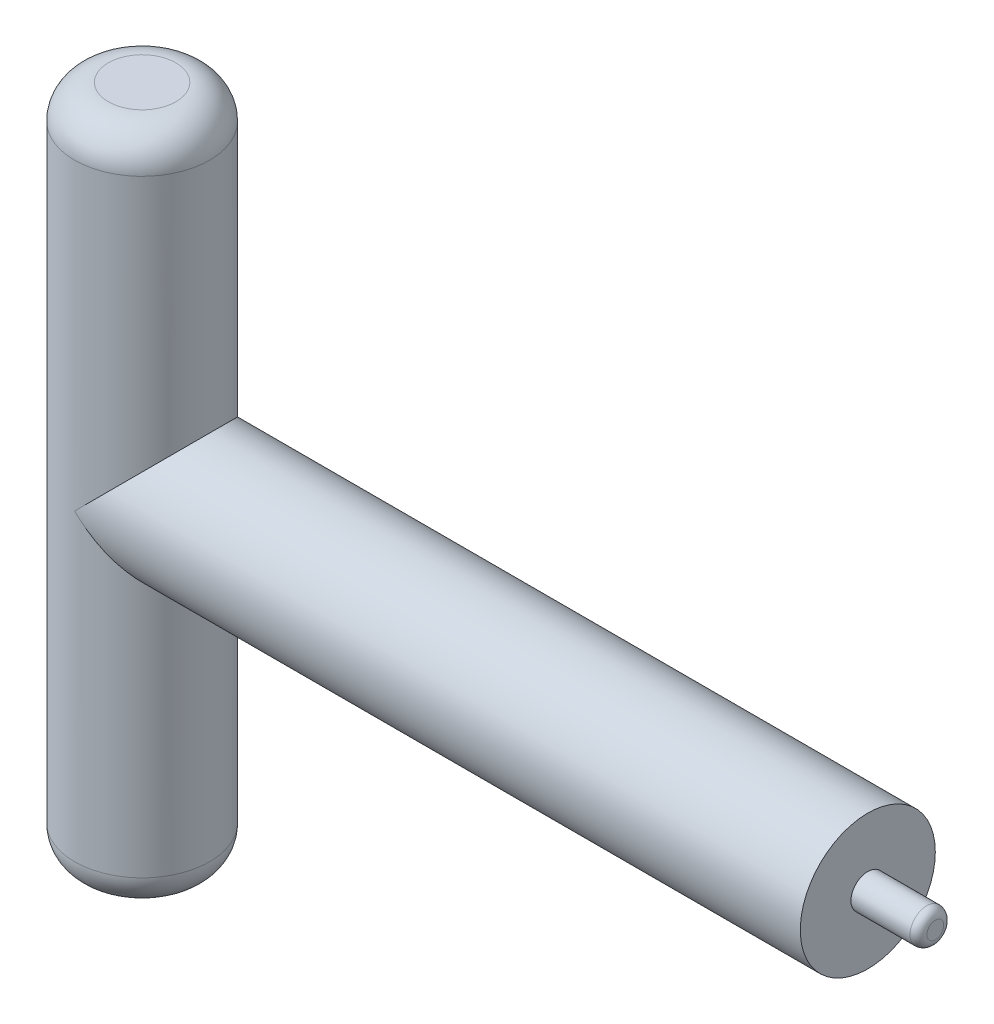
ISO-10303-21;
HEADER;
FILE_DESCRIPTION(('STEP AP214'),'2;1');
FILE_NAME('part.step','',(''),(''),'','','');
FILE_SCHEMA(('AUTOMOTIVE_DESIGN { 1 0 10303 214 1 1 1 1 }'));
ENDSEC;
DATA;
#1=APPLICATION_CONTEXT('core data for automotive mechanical design processes');
#2=APPLICATION_PROTOCOL_DEFINITION('international standard','automotive_design',2000,#1);
#3=PRODUCT_CONTEXT('',#1,'mechanical');
#4=PRODUCT('Part','Part','',(#3));
#5=PRODUCT_RELATED_PRODUCT_CATEGORY('part','',(#4));
#6=PRODUCT_DEFINITION_FORMATION('','',#4);
#7=PRODUCT_DEFINITION_CONTEXT('part definition',#1,'design');
#8=PRODUCT_DEFINITION('design','',#6,#7);
#9=PRODUCT_DEFINITION_SHAPE('','',#8);
#10=(LENGTH_UNIT() NAMED_UNIT(*) SI_UNIT(.MILLI.,.METRE.));
#11=(NAMED_UNIT(*) PLANE_ANGLE_UNIT() SI_UNIT($,.RADIAN.));
#12=(NAMED_UNIT(*) SI_UNIT($,.STERADIAN.) SOLID_ANGLE_UNIT());
#13=UNCERTAINTY_MEASURE_WITH_UNIT(LENGTH_MEASURE(1.E-05),#10,'distance_accuracy_value','');
#14=(GEOMETRIC_REPRESENTATION_CONTEXT(3) GLOBAL_UNCERTAINTY_ASSIGNED_CONTEXT((#13)) GLOBAL_UNIT_ASSIGNED_CONTEXT((#10,
#11,#12)) REPRESENTATION_CONTEXT('',''));
#15=CARTESIAN_POINT('',(0.,0.,0.));
#16=DIRECTION('',(0.,0.,1.));
#17=DIRECTION('',(1.,0.,0.));
#18=AXIS2_PLACEMENT_3D('',#15,#16,#17);
#19=CARTESIAN_POINT('',(136.525,0.,0.));
#20=DIRECTION('',(-1.,0.,0.));
#21=DIRECTION('',(0.,0.,1.));
#22=AXIS2_PLACEMENT_3D('',#19,#20,#21);
#23=CYLINDRICAL_SURFACE('',#22,12.7);
#24=CARTESIAN_POINT('',(136.525,0.,0.));
#25=DIRECTION('',(1.,0.,0.));
#26=DIRECTION('',(0.,0.,-1.));
#27=AXIS2_PLACEMENT_3D('',#24,#25,#26);
#28=CIRCLE('',#27,12.7);
#29=CARTESIAN_POINT('',(136.525,0.,-12.7));
#30=VERTEX_POINT('',#29);
#31=EDGE_CURVE('E59',#30,#30,#28,.T.);
#32=ORIENTED_EDGE('',*,*,#31,.F.);
#33=EDGE_LOOP('',(#32));
#34=FACE_BOUND('',#33,.T.);
#35=CARTESIAN_POINT('',(0.,0.,0.));
#36=DIRECTION('',(-0.707106781186547,-0.707106781186547,0.));
#37=DIRECTION('',(-0.707106781186547,0.707106781186547,0.));
#38=AXIS2_PLACEMENT_3D('',#35,#36,#37);
#39=ELLIPSE('',#38,17.9605122421383,12.7);
#40=CARTESIAN_POINT('',(0.,0.,12.7));
#41=VERTEX_POINT('',#40);
#42=CARTESIAN_POINT('',(0.,0.,-12.7));
#43=VERTEX_POINT('',#42);
#44=EDGE_CURVE('E55',#41,#43,#39,.F.);
#45=ORIENTED_EDGE('',*,*,#44,.T.);
#46=CARTESIAN_POINT('',(0.,0.,0.));
#47=DIRECTION('',(-0.707106781186547,0.707106781186547,0.));
#48=DIRECTION('',(-0.707106781186547,-0.707106781186547,0.));
#49=AXIS2_PLACEMENT_3D('',#46,#47,#48);
#50=ELLIPSE('',#49,17.9605122421383,12.7);
#51=EDGE_CURVE('E53',#43,#41,#50,.F.);
#52=ORIENTED_EDGE('',*,*,#51,.T.);
#53=EDGE_LOOP('',(#45,#52));
#54=FACE_BOUND('',#53,.T.);
#55=ADVANCED_FACE('F39',(#34,#54),#23,.T.);
#56=CARTESIAN_POINT('',(136.525,0.,0.));
#57=DIRECTION('',(1.,0.,0.));
#58=DIRECTION('',(0.,0.,-1.));
#59=AXIS2_PLACEMENT_3D('',#56,#57,#58);
#60=PLANE('',#59);
#61=CARTESIAN_POINT('',(136.525,0.,0.));
#62=DIRECTION('',(1.,0.,0.));
#63=DIRECTION('',(0.,0.,-1.));
#64=AXIS2_PLACEMENT_3D('',#61,#62,#63);
#65=CIRCLE('',#64,3.175);
#66=CARTESIAN_POINT('',(136.525,0.,-3.175));
#67=VERTEX_POINT('',#66);
#68=EDGE_CURVE('E62',#67,#67,#65,.T.);
#69=ORIENTED_EDGE('',*,*,#68,.F.);
#70=EDGE_LOOP('',(#69));
#71=FACE_BOUND('',#70,.T.);
#72=ORIENTED_EDGE('',*,*,#31,.T.);
#73=EDGE_LOOP('',(#72));
#74=FACE_BOUND('',#73,.T.);
#75=ADVANCED_FACE('F98',(#71,#74),#60,.T.);
#76=CARTESIAN_POINT('',(149.225,0.,0.));
#77=DIRECTION('',(-1.,0.,0.));
#78=DIRECTION('',(0.,0.,1.));
#79=AXIS2_PLACEMENT_3D('',#76,#77,#78);
#80=CYLINDRICAL_SURFACE('',#79,3.175);
#81=CARTESIAN_POINT('',(147.6375,0.,0.));
#82=DIRECTION('',(1.,0.,0.));
#83=DIRECTION('',(0.,0.,-1.));
#84=AXIS2_PLACEMENT_3D('',#81,#82,#83);
#85=CIRCLE('',#84,3.175);
#86=CARTESIAN_POINT('',(147.6375,0.,-3.175));
#87=VERTEX_POINT('',#86);
#88=EDGE_CURVE('E70',#87,#87,#85,.F.);
#89=ORIENTED_EDGE('',*,*,#88,.T.);
#90=EDGE_LOOP('',(#89));
#91=FACE_BOUND('',#90,.T.);
#92=ORIENTED_EDGE('',*,*,#68,.T.);
#93=EDGE_LOOP('',(#92));
#94=FACE_BOUND('',#93,.T.);
#95=ADVANCED_FACE('F106',(#91,#94),#80,.T.);
#96=CARTESIAN_POINT('',(149.225,0.,0.));
#97=DIRECTION('',(1.,0.,0.));
#98=DIRECTION('',(0.,0.,-1.));
#99=AXIS2_PLACEMENT_3D('',#96,#97,#98);
#100=PLANE('',#99);
#101=CARTESIAN_POINT('',(149.225,0.,0.));
#102=DIRECTION('',(1.,0.,0.));
#103=DIRECTION('',(0.,0.,-1.));
#104=AXIS2_PLACEMENT_3D('',#101,#102,#103);
#105=CIRCLE('',#104,1.5875);
#106=CARTESIAN_POINT('',(149.225,0.,-1.5875));
#107=VERTEX_POINT('',#106);
#108=EDGE_CURVE('E66',#107,#107,#105,.T.);
#109=ORIENTED_EDGE('',*,*,#108,.T.);
#110=EDGE_LOOP('',(#109));
#111=FACE_BOUND('',#110,.T.);
#112=ADVANCED_FACE('F113',(#111),#100,.T.);
#113=CARTESIAN_POINT('',(147.6375,0.,0.));
#114=DIRECTION('',(1.,0.,0.));
#115=DIRECTION('',(0.,0.,-1.));
#116=AXIS2_PLACEMENT_3D('',#113,#114,#115);
#117=DEGENERATE_TOROIDAL_SURFACE('',#116,1.5875,1.5875,.T.);
#118=ORIENTED_EDGE('',*,*,#88,.F.);
#119=EDGE_LOOP('',(#118));
#120=FACE_BOUND('',#119,.T.);
#121=ORIENTED_EDGE('',*,*,#108,.F.);
#122=EDGE_LOOP('',(#121));
#123=FACE_BOUND('',#122,.T.);
#124=ADVANCED_FACE('F112',(#120,#123),#117,.T.);
#125=CARTESIAN_POINT('',(0.,-63.5,0.));
#126=DIRECTION('',(0.,1.,0.));
#127=DIRECTION('',(0.,0.,1.));
#128=AXIS2_PLACEMENT_3D('',#125,#126,#127);
#129=CYLINDRICAL_SURFACE('',#128,12.7);
#130=CARTESIAN_POINT('',(0.,57.15,0.));
#131=DIRECTION('',(0.,1.,0.));
#132=DIRECTION('',(0.,0.,1.));
#133=AXIS2_PLACEMENT_3D('',#130,#131,#132);
#134=CIRCLE('',#133,12.7);
#135=CARTESIAN_POINT('',(0.,57.15,12.7));
#136=VERTEX_POINT('',#135);
#137=EDGE_CURVE('E47',#136,#136,#134,.F.);
#138=ORIENTED_EDGE('',*,*,#137,.T.);
#139=EDGE_LOOP('',(#138));
#140=FACE_BOUND('',#139,.T.);
#141=CARTESIAN_POINT('',(0.,-57.15,0.));
#142=DIRECTION('',(0.,1.,0.));
#143=DIRECTION('',(0.,0.,1.));
#144=AXIS2_PLACEMENT_3D('',#141,#142,#143);
#145=CIRCLE('',#144,12.7);
#146=CARTESIAN_POINT('',(0.,-57.15,12.7));
#147=VERTEX_POINT('',#146);
#148=EDGE_CURVE('E76',#147,#147,#145,.T.);
#149=ORIENTED_EDGE('',*,*,#148,.T.);
#150=EDGE_LOOP('',(#149));
#151=FACE_BOUND('',#150,.T.);
#152=ORIENTED_EDGE('',*,*,#51,.F.);
#153=ORIENTED_EDGE('',*,*,#44,.F.);
#154=EDGE_LOOP('',(#152,#153));
#155=FACE_BOUND('',#154,.T.);
#156=ADVANCED_FACE('F56',(#140,#151,#155),#129,.T.);
#157=CARTESIAN_POINT('',(0.,-63.5,0.));
#158=DIRECTION('',(0.,1.,0.));
#159=DIRECTION('',(0.,0.,1.));
#160=AXIS2_PLACEMENT_3D('',#157,#158,#159);
#161=PLANE('',#160);
#162=CARTESIAN_POINT('',(0.,-63.5,0.));
#163=DIRECTION('',(0.,1.,0.));
#164=DIRECTION('',(0.,0.,1.));
#165=AXIS2_PLACEMENT_3D('',#162,#163,#164);
#166=CIRCLE('',#165,6.35);
#167=CARTESIAN_POINT('',(0.,-63.5,6.35));
#168=VERTEX_POINT('',#167);
#169=EDGE_CURVE('E11',#168,#168,#166,.F.);
#170=ORIENTED_EDGE('',*,*,#169,.T.);
#171=EDGE_LOOP('',(#170));
#172=FACE_BOUND('',#171,.T.);
#173=ADVANCED_FACE('F90',(#172),#161,.F.);
#174=CARTESIAN_POINT('',(0.,63.5,0.));
#175=DIRECTION('',(0.,1.,0.));
#176=DIRECTION('',(0.,0.,1.));
#177=AXIS2_PLACEMENT_3D('',#174,#175,#176);
#178=PLANE('',#177);
#179=CARTESIAN_POINT('',(0.,63.5,0.));
#180=DIRECTION('',(0.,1.,0.));
#181=DIRECTION('',(0.,0.,1.));
#182=AXIS2_PLACEMENT_3D('',#179,#180,#181);
#183=CIRCLE('',#182,6.35);
#184=CARTESIAN_POINT('',(0.,63.5,6.35));
#185=VERTEX_POINT('',#184);
#186=EDGE_CURVE('E73',#185,#185,#183,.T.);
#187=ORIENTED_EDGE('',*,*,#186,.T.);
#188=EDGE_LOOP('',(#187));
#189=FACE_BOUND('',#188,.T.);
#190=ADVANCED_FACE('F86',(#189),#178,.T.);
#191=CARTESIAN_POINT('',(0.,57.15,0.));
#192=DIRECTION('',(0.,1.,0.));
#193=DIRECTION('',(0.,0.,1.));
#194=AXIS2_PLACEMENT_3D('',#191,#192,#193);
#195=DEGENERATE_TOROIDAL_SURFACE('',#194,6.35,6.35,.T.);
#196=ORIENTED_EDGE('',*,*,#137,.F.);
#197=EDGE_LOOP('',(#196));
#198=FACE_BOUND('',#197,.T.);
#199=ORIENTED_EDGE('',*,*,#186,.F.);
#200=EDGE_LOOP('',(#199));
#201=FACE_BOUND('',#200,.T.);
#202=ADVANCED_FACE('F83',(#198,#201),#195,.T.);
#203=CARTESIAN_POINT('',(0.,-57.15,0.));
#204=DIRECTION('',(0.,1.,0.));
#205=DIRECTION('',(0.,0.,1.));
#206=AXIS2_PLACEMENT_3D('',#203,#204,#205);
#207=DEGENERATE_TOROIDAL_SURFACE('',#206,6.35,6.35,.T.);
#208=ORIENTED_EDGE('',*,*,#169,.F.);
#209=EDGE_LOOP('',(#208));
#210=FACE_BOUND('',#209,.T.);
#211=ORIENTED_EDGE('',*,*,#148,.F.);
#212=EDGE_LOOP('',(#211));
#213=FACE_BOUND('',#212,.T.);
#214=ADVANCED_FACE('F41',(#210,#213),#207,.T.);
#215=CLOSED_SHELL('',(#55,#75,#95,#112,#124,#156,#173,#190,#202,#214));
#216=MANIFOLD_SOLID_BREP('B2',#215);
#217=ADVANCED_BREP_SHAPE_REPRESENTATION('',(#18,#216),#14);
#218=SHAPE_DEFINITION_REPRESENTATION(#9,#217);
ENDSEC;
END-ISO-10303-21;
